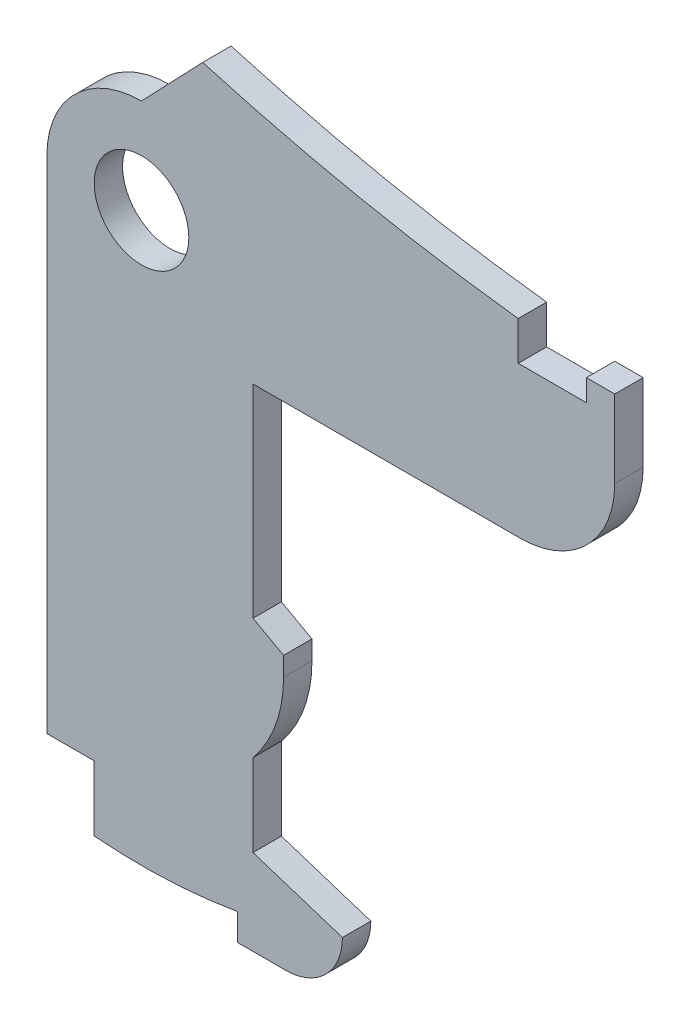
ISO-10303-21;
HEADER;
FILE_DESCRIPTION(('STEP AP214'),'2;1');
FILE_NAME('part.step','',(''),(''),'','','');
FILE_SCHEMA(('AUTOMOTIVE_DESIGN { 1 0 10303 214 1 1 1 1 }'));
ENDSEC;
DATA;
#1=APPLICATION_CONTEXT('core data for automotive mechanical design processes');
#2=APPLICATION_PROTOCOL_DEFINITION('international standard','automotive_design',2000,#1);
#3=PRODUCT_CONTEXT('',#1,'mechanical');
#4=PRODUCT('Part','Part','',(#3));
#5=PRODUCT_RELATED_PRODUCT_CATEGORY('part','',(#4));
#6=PRODUCT_DEFINITION_FORMATION('','',#4);
#7=PRODUCT_DEFINITION_CONTEXT('part definition',#1,'design');
#8=PRODUCT_DEFINITION('design','',#6,#7);
#9=PRODUCT_DEFINITION_SHAPE('','',#8);
#10=(LENGTH_UNIT() NAMED_UNIT(*) SI_UNIT(.MILLI.,.METRE.));
#11=(NAMED_UNIT(*) PLANE_ANGLE_UNIT() SI_UNIT($,.RADIAN.));
#12=(NAMED_UNIT(*) SI_UNIT($,.STERADIAN.) SOLID_ANGLE_UNIT());
#13=UNCERTAINTY_MEASURE_WITH_UNIT(LENGTH_MEASURE(1.E-05),#10,'distance_accuracy_value','');
#14=(GEOMETRIC_REPRESENTATION_CONTEXT(3) GLOBAL_UNCERTAINTY_ASSIGNED_CONTEXT((#13)) GLOBAL_UNIT_ASSIGNED_CONTEXT((#10,
#11,#12)) REPRESENTATION_CONTEXT('',''));
#15=CARTESIAN_POINT('',(0.,0.,0.));
#16=DIRECTION('',(0.,0.,1.));
#17=DIRECTION('',(1.,0.,0.));
#18=AXIS2_PLACEMENT_3D('',#15,#16,#17);
#19=CARTESIAN_POINT('',(0.,-69.1109493092821,1.5));
#20=DIRECTION('',(0.,1.,0.));
#21=DIRECTION('',(0.,0.,1.));
#22=AXIS2_PLACEMENT_3D('',#19,#20,#21);
#23=PLANE('',#22);
#24=DIRECTION('',(1.,0.,0.));
#25=VECTOR('',#24,1.);
#26=CARTESIAN_POINT('',(0.,-69.1109493092821,0.));
#27=LINE('',#26,#25);
#28=CARTESIAN_POINT('',(58.5628566486414,-69.1109493092821,0.));
#29=VERTEX_POINT('',#28);
#30=CARTESIAN_POINT('',(61.1004317090133,-69.1109493092821,0.));
#31=VERTEX_POINT('',#30);
#32=EDGE_CURVE('E227',#29,#31,#27,.T.);
#33=ORIENTED_EDGE('',*,*,#32,.T.);
#34=DIRECTION('',(0.,0.,-1.));
#35=VECTOR('',#34,1.);
#36=CARTESIAN_POINT('',(61.1004317090133,-69.1109493092821,1.5));
#37=LINE('',#36,#35);
#38=CARTESIAN_POINT('',(61.1004317090133,-69.1109493092821,1.5));
#39=VERTEX_POINT('',#38);
#40=EDGE_CURVE('E11',#39,#31,#37,.T.);
#41=ORIENTED_EDGE('',*,*,#40,.F.);
#42=DIRECTION('',(1.,0.,0.));
#43=VECTOR('',#42,1.);
#44=CARTESIAN_POINT('',(0.,-69.1109493092821,1.5));
#45=LINE('',#44,#43);
#46=CARTESIAN_POINT('',(58.5628566486414,-69.1109493092821,1.5));
#47=VERTEX_POINT('',#46);
#48=EDGE_CURVE('E399',#47,#39,#45,.T.);
#49=ORIENTED_EDGE('',*,*,#48,.F.);
#50=DIRECTION('',(0.,0.,-1.));
#51=VECTOR('',#50,1.);
#52=CARTESIAN_POINT('',(58.5628566486414,-69.1109493092821,1.5));
#53=LINE('',#52,#51);
#54=EDGE_CURVE('E223',#47,#29,#53,.T.);
#55=ORIENTED_EDGE('',*,*,#54,.T.);
#56=EDGE_LOOP('',(#33,#41,#49,#55));
#57=FACE_BOUND('',#56,.T.);
#58=ADVANCED_FACE('F35',(#57),#23,.F.);
#59=CARTESIAN_POINT('',(61.1004317090133,-66.1109493092821,1.5));
#60=DIRECTION('',(0.,0.,-1.));
#61=DIRECTION('',(-1.,0.,0.));
#62=AXIS2_PLACEMENT_3D('',#59,#60,#61);
#63=CYLINDRICAL_SURFACE('',#62,3.00000000000001);
#64=CARTESIAN_POINT('',(61.1004317090133,-66.1109493092821,0.));
#65=DIRECTION('',(0.,0.,1.));
#66=DIRECTION('',(1.,0.,0.));
#67=AXIS2_PLACEMENT_3D('',#64,#65,#66);
#68=CIRCLE('',#67,3.00000000000001);
#69=CARTESIAN_POINT('',(64.1004317090133,-66.1109493092821,0.));
#70=VERTEX_POINT('',#69);
#71=EDGE_CURVE('E230',#31,#70,#68,.T.);
#72=ORIENTED_EDGE('',*,*,#71,.T.);
#73=DIRECTION('',(0.,0.,-1.));
#74=VECTOR('',#73,1.);
#75=CARTESIAN_POINT('',(64.1004317090133,-66.1109493092821,1.5));
#76=LINE('',#75,#74);
#77=CARTESIAN_POINT('',(64.1004317090133,-66.1109493092821,1.5));
#78=VERTEX_POINT('',#77);
#79=EDGE_CURVE('E44',#78,#70,#76,.T.);
#80=ORIENTED_EDGE('',*,*,#79,.F.);
#81=CARTESIAN_POINT('',(61.1004317090133,-66.1109493092821,1.5));
#82=DIRECTION('',(0.,0.,1.));
#83=DIRECTION('',(1.,0.,0.));
#84=AXIS2_PLACEMENT_3D('',#81,#82,#83);
#85=CIRCLE('',#84,3.00000000000001);
#86=EDGE_CURVE('E139',#39,#78,#85,.T.);
#87=ORIENTED_EDGE('',*,*,#86,.F.);
#88=ORIENTED_EDGE('',*,*,#40,.T.);
#89=EDGE_LOOP('',(#72,#80,#87,#88));
#90=FACE_BOUND('',#89,.T.);
#91=ADVANCED_FACE('F413',(#90),#63,.T.);
#92=CARTESIAN_POINT('',(-13.2752413972475,-41.1476724947514,1.5));
#93=DIRECTION('',(-0.307040459564451,-0.951696462213899,0.));
#94=DIRECTION('',(0.951696462213899,-0.307040459564451,0.));
#95=AXIS2_PLACEMENT_3D('',#92,#93,#94);
#96=PLANE('',#95);
#97=DIRECTION('',(-0.951696462213899,0.307040459564451,0.));
#98=VECTOR('',#97,1.);
#99=CARTESIAN_POINT('',(-13.2752413972475,-41.1476724947514,0.));
#100=LINE('',#99,#98);
#101=CARTESIAN_POINT('',(59.3761202637687,-64.5867713650885,0.));
#102=VERTEX_POINT('',#101);
#103=EDGE_CURVE('E232',#70,#102,#100,.T.);
#104=ORIENTED_EDGE('',*,*,#103,.T.);
#105=DIRECTION('',(0.,0.,-1.));
#106=VECTOR('',#105,1.);
#107=CARTESIAN_POINT('',(59.3761202637687,-64.5867713650885,1.5));
#108=LINE('',#107,#106);
#109=CARTESIAN_POINT('',(59.3761202637687,-64.5867713650885,1.5));
#110=VERTEX_POINT('',#109);
#111=EDGE_CURVE('E325',#110,#102,#108,.T.);
#112=ORIENTED_EDGE('',*,*,#111,.F.);
#113=DIRECTION('',(-0.951696462213899,0.307040459564451,0.));
#114=VECTOR('',#113,1.);
#115=CARTESIAN_POINT('',(-13.2752413972475,-41.1476724947514,1.5));
#116=LINE('',#115,#114);
#117=EDGE_CURVE('E332',#78,#110,#116,.T.);
#118=ORIENTED_EDGE('',*,*,#117,.F.);
#119=ORIENTED_EDGE('',*,*,#79,.T.);
#120=EDGE_LOOP('',(#104,#112,#118,#119));
#121=FACE_BOUND('',#120,.T.);
#122=ADVANCED_FACE('F330',(#121),#96,.F.);
#123=CARTESIAN_POINT('',(59.3761202637687,0.,1.5));
#124=DIRECTION('',(1.,0.,0.));
#125=DIRECTION('',(0.,0.,-1.));
#126=AXIS2_PLACEMENT_3D('',#123,#124,#125);
#127=PLANE('',#126);
#128=DIRECTION('',(0.,-1.,0.));
#129=VECTOR('',#128,1.);
#130=CARTESIAN_POINT('',(59.3761202637687,0.,0.));
#131=LINE('',#130,#129);
#132=CARTESIAN_POINT('',(59.3761202637687,-60.2400285328767,0.));
#133=VERTEX_POINT('',#132);
#134=EDGE_CURVE('E235',#133,#102,#131,.T.);
#135=ORIENTED_EDGE('',*,*,#134,.F.);
#136=DIRECTION('',(0.,0.,-1.));
#137=VECTOR('',#136,1.);
#138=CARTESIAN_POINT('',(59.3761202637687,-60.2400285328767,1.5));
#139=LINE('',#138,#137);
#140=CARTESIAN_POINT('',(59.3761202637687,-60.2400285328767,1.5));
#141=VERTEX_POINT('',#140);
#142=EDGE_CURVE('E323',#141,#133,#139,.T.);
#143=ORIENTED_EDGE('',*,*,#142,.F.);
#144=DIRECTION('',(0.,-1.,0.));
#145=VECTOR('',#144,1.);
#146=CARTESIAN_POINT('',(59.3761202637687,0.,1.5));
#147=LINE('',#146,#145);
#148=EDGE_CURVE('E343',#141,#110,#147,.T.);
#149=ORIENTED_EDGE('',*,*,#148,.T.);
#150=ORIENTED_EDGE('',*,*,#111,.T.);
#151=EDGE_LOOP('',(#135,#143,#149,#150));
#152=FACE_BOUND('',#151,.T.);
#153=ADVANCED_FACE('F340',(#152),#127,.T.);
#154=CARTESIAN_POINT('',(53.95842090491,-55.7530720627505,1.5));
#155=DIRECTION('',(0.,0.,-1.));
#156=DIRECTION('',(-1.,0.,0.));
#157=AXIS2_PLACEMENT_3D('',#154,#155,#156);
#158=CYLINDRICAL_SURFACE('',#157,7.03450387076339);
#159=CARTESIAN_POINT('',(53.95842090491,-55.7530720627505,0.));
#160=DIRECTION('',(0.,0.,1.));
#161=DIRECTION('',(1.,0.,0.));
#162=AXIS2_PLACEMENT_3D('',#159,#160,#161);
#163=CIRCLE('',#162,7.03450387076339);
#164=CARTESIAN_POINT('',(60.9929247756734,-55.7530720627505,0.));
#165=VERTEX_POINT('',#164);
#166=EDGE_CURVE('E238',#165,#133,#163,.F.);
#167=ORIENTED_EDGE('',*,*,#166,.F.);
#168=DIRECTION('',(0.,0.,-1.));
#169=VECTOR('',#168,1.);
#170=CARTESIAN_POINT('',(60.9929247756734,-55.7530720627505,1.5));
#171=LINE('',#170,#169);
#172=CARTESIAN_POINT('',(60.9929247756734,-55.7530720627505,1.5));
#173=VERTEX_POINT('',#172);
#174=EDGE_CURVE('E321',#173,#165,#171,.T.);
#175=ORIENTED_EDGE('',*,*,#174,.F.);
#176=CARTESIAN_POINT('',(53.95842090491,-55.7530720627505,1.5));
#177=DIRECTION('',(0.,0.,1.));
#178=DIRECTION('',(1.,0.,0.));
#179=AXIS2_PLACEMENT_3D('',#176,#177,#178);
#180=CIRCLE('',#179,7.03450387076339);
#181=EDGE_CURVE('E346',#173,#141,#180,.F.);
#182=ORIENTED_EDGE('',*,*,#181,.T.);
#183=ORIENTED_EDGE('',*,*,#142,.T.);
#184=EDGE_LOOP('',(#167,#175,#182,#183));
#185=FACE_BOUND('',#184,.T.);
#186=ADVANCED_FACE('F423',(#185),#158,.T.);
#187=CARTESIAN_POINT('',(60.9929247756734,0.,1.5));
#188=DIRECTION('',(-1.,0.,0.));
#189=DIRECTION('',(0.,0.,1.));
#190=AXIS2_PLACEMENT_3D('',#187,#188,#189);
#191=PLANE('',#190);
#192=DIRECTION('',(0.,1.,0.));
#193=VECTOR('',#192,1.);
#194=CARTESIAN_POINT('',(60.9929247756734,0.,0.));
#195=LINE('',#194,#193);
#196=CARTESIAN_POINT('',(60.9929247756734,-54.7553142853299,0.));
#197=VERTEX_POINT('',#196);
#198=EDGE_CURVE('E241',#165,#197,#195,.T.);
#199=ORIENTED_EDGE('',*,*,#198,.T.);
#200=DIRECTION('',(0.,0.,-1.));
#201=VECTOR('',#200,1.);
#202=CARTESIAN_POINT('',(60.9929247756734,-54.7553142853299,1.5));
#203=LINE('',#202,#201);
#204=CARTESIAN_POINT('',(60.9929247756734,-54.7553142853299,1.5));
#205=VERTEX_POINT('',#204);
#206=EDGE_CURVE('E318',#205,#197,#203,.T.);
#207=ORIENTED_EDGE('',*,*,#206,.F.);
#208=DIRECTION('',(0.,1.,0.));
#209=VECTOR('',#208,1.);
#210=CARTESIAN_POINT('',(60.9929247756734,0.,1.5));
#211=LINE('',#210,#209);
#212=EDGE_CURVE('E348',#173,#205,#211,.T.);
#213=ORIENTED_EDGE('',*,*,#212,.F.);
#214=ORIENTED_EDGE('',*,*,#174,.T.);
#215=EDGE_LOOP('',(#199,#207,#213,#214));
#216=FACE_BOUND('',#215,.T.);
#217=ADVANCED_FACE('F426',(#216),#191,.F.);
#218=CARTESIAN_POINT('',(-8.97597044556049,-16.3550723728844,1.5));
#219=DIRECTION('',(-0.481123509234274,-0.876652821168162,0.));
#220=DIRECTION('',(0.876652821168162,-0.481123509234274,0.));
#221=AXIS2_PLACEMENT_3D('',#218,#219,#220);
#222=PLANE('',#221);
#223=DIRECTION('',(-0.876652821168162,0.481123509234274,0.));
#224=VECTOR('',#223,1.);
#225=CARTESIAN_POINT('',(-8.97597044556049,-16.3550723728844,0.));
#226=LINE('',#225,#224);
#227=CARTESIAN_POINT('',(59.3761202637687,-53.8679816472202,0.));
#228=VERTEX_POINT('',#227);
#229=EDGE_CURVE('E243',#197,#228,#226,.T.);
#230=ORIENTED_EDGE('',*,*,#229,.T.);
#231=DIRECTION('',(0.,0.,-1.));
#232=VECTOR('',#231,1.);
#233=CARTESIAN_POINT('',(59.3761202637687,-53.8679816472202,1.5));
#234=LINE('',#233,#232);
#235=CARTESIAN_POINT('',(59.3761202637687,-53.8679816472202,1.5));
#236=VERTEX_POINT('',#235);
#237=EDGE_CURVE('E316',#236,#228,#234,.T.);
#238=ORIENTED_EDGE('',*,*,#237,.F.);
#239=DIRECTION('',(-0.876652821168162,0.481123509234274,0.));
#240=VECTOR('',#239,1.);
#241=CARTESIAN_POINT('',(-8.97597044556049,-16.3550723728844,1.5));
#242=LINE('',#241,#240);
#243=EDGE_CURVE('E354',#205,#236,#242,.T.);
#244=ORIENTED_EDGE('',*,*,#243,.F.);
#245=ORIENTED_EDGE('',*,*,#206,.T.);
#246=EDGE_LOOP('',(#230,#238,#244,#245));
#247=FACE_BOUND('',#246,.T.);
#248=ADVANCED_FACE('F430',(#247),#222,.F.);
#249=CARTESIAN_POINT('',(59.3761202637687,0.,1.5));
#250=DIRECTION('',(1.,0.,0.));
#251=DIRECTION('',(0.,0.,-1.));
#252=AXIS2_PLACEMENT_3D('',#249,#250,#251);
#253=PLANE('',#252);
#254=DIRECTION('',(0.,-1.,0.));
#255=VECTOR('',#254,1.);
#256=CARTESIAN_POINT('',(59.3761202637687,0.,0.));
#257=LINE('',#256,#255);
#258=CARTESIAN_POINT('',(59.3761202637687,-43.149191929352,0.));
#259=VERTEX_POINT('',#258);
#260=EDGE_CURVE('E246',#259,#228,#257,.T.);
#261=ORIENTED_EDGE('',*,*,#260,.F.);
#262=DIRECTION('',(0.,0.,-1.));
#263=VECTOR('',#262,1.);
#264=CARTESIAN_POINT('',(59.3761202637687,-43.149191929352,1.5));
#265=LINE('',#264,#263);
#266=CARTESIAN_POINT('',(59.3761202637687,-43.149191929352,1.5));
#267=VERTEX_POINT('',#266);
#268=EDGE_CURVE('E314',#267,#259,#265,.T.);
#269=ORIENTED_EDGE('',*,*,#268,.F.);
#270=DIRECTION('',(0.,-1.,0.));
#271=VECTOR('',#270,1.);
#272=CARTESIAN_POINT('',(59.3761202637687,0.,1.5));
#273=LINE('',#272,#271);
#274=EDGE_CURVE('E356',#267,#236,#273,.T.);
#275=ORIENTED_EDGE('',*,*,#274,.T.);
#276=ORIENTED_EDGE('',*,*,#237,.T.);
#277=EDGE_LOOP('',(#261,#269,#275,#276));
#278=FACE_BOUND('',#277,.T.);
#279=ADVANCED_FACE('F434',(#278),#253,.T.);
#280=CARTESIAN_POINT('',(0.,-43.149191929352,1.5));
#281=DIRECTION('',(0.,-1.,0.));
#282=DIRECTION('',(0.,0.,-1.));
#283=AXIS2_PLACEMENT_3D('',#280,#281,#282);
#284=PLANE('',#283);
#285=DIRECTION('',(-1.,0.,0.));
#286=VECTOR('',#285,1.);
#287=CARTESIAN_POINT('',(0.,-43.149191929352,0.));
#288=LINE('',#287,#286);
#289=CARTESIAN_POINT('',(73.4867153231227,-43.149191929352,0.));
#290=VERTEX_POINT('',#289);
#291=EDGE_CURVE('E249',#290,#259,#288,.T.);
#292=ORIENTED_EDGE('',*,*,#291,.F.);
#293=DIRECTION('',(0.,0.,-1.));
#294=VECTOR('',#293,1.);
#295=CARTESIAN_POINT('',(73.4867153231227,-43.149191929352,1.5));
#296=LINE('',#295,#294);
#297=CARTESIAN_POINT('',(73.4867153231227,-43.149191929352,1.5));
#298=VERTEX_POINT('',#297);
#299=EDGE_CURVE('E312',#298,#290,#296,.T.);
#300=ORIENTED_EDGE('',*,*,#299,.F.);
#301=DIRECTION('',(-1.,0.,0.));
#302=VECTOR('',#301,1.);
#303=CARTESIAN_POINT('',(0.,-43.149191929352,1.5));
#304=LINE('',#303,#302);
#305=EDGE_CURVE('E359',#298,#267,#304,.T.);
#306=ORIENTED_EDGE('',*,*,#305,.T.);
#307=ORIENTED_EDGE('',*,*,#268,.T.);
#308=EDGE_LOOP('',(#292,#300,#306,#307));
#309=FACE_BOUND('',#308,.T.);
#310=ADVANCED_FACE('F438',(#309),#284,.T.);
#311=CARTESIAN_POINT('',(73.4867153231227,-38.149191929352,1.5));
#312=DIRECTION('',(0.,0.,-1.));
#313=DIRECTION('',(-1.,0.,0.));
#314=AXIS2_PLACEMENT_3D('',#311,#312,#313);
#315=CYLINDRICAL_SURFACE('',#314,5.);
#316=CARTESIAN_POINT('',(73.4867153231227,-38.149191929352,0.));
#317=DIRECTION('',(0.,0.,1.));
#318=DIRECTION('',(1.,0.,0.));
#319=AXIS2_PLACEMENT_3D('',#316,#317,#318);
#320=CIRCLE('',#319,5.);
#321=CARTESIAN_POINT('',(78.4867153231227,-38.149191929352,0.));
#322=VERTEX_POINT('',#321);
#323=EDGE_CURVE('E252',#322,#290,#320,.F.);
#324=ORIENTED_EDGE('',*,*,#323,.F.);
#325=DIRECTION('',(0.,0.,-1.));
#326=VECTOR('',#325,1.);
#327=CARTESIAN_POINT('',(78.4867153231227,-38.149191929352,1.5));
#328=LINE('',#327,#326);
#329=CARTESIAN_POINT('',(78.4867153231227,-38.149191929352,1.5));
#330=VERTEX_POINT('',#329);
#331=EDGE_CURVE('E310',#330,#322,#328,.T.);
#332=ORIENTED_EDGE('',*,*,#331,.F.);
#333=CARTESIAN_POINT('',(73.4867153231227,-38.149191929352,1.5));
#334=DIRECTION('',(0.,0.,1.));
#335=DIRECTION('',(1.,0.,0.));
#336=AXIS2_PLACEMENT_3D('',#333,#334,#335);
#337=CIRCLE('',#336,5.);
#338=EDGE_CURVE('E362',#330,#298,#337,.F.);
#339=ORIENTED_EDGE('',*,*,#338,.T.);
#340=ORIENTED_EDGE('',*,*,#299,.T.);
#341=EDGE_LOOP('',(#324,#332,#339,#340));
#342=FACE_BOUND('',#341,.T.);
#343=ADVANCED_FACE('F442',(#342),#315,.T.);
#344=CARTESIAN_POINT('',(78.4867153231227,0.,1.5));
#345=DIRECTION('',(1.,0.,0.));
#346=DIRECTION('',(0.,0.,-1.));
#347=AXIS2_PLACEMENT_3D('',#344,#345,#346);
#348=PLANE('',#347);
#349=DIRECTION('',(0.,-1.,0.));
#350=VECTOR('',#349,1.);
#351=CARTESIAN_POINT('',(78.4867153231227,0.,0.));
#352=LINE('',#351,#350);
#353=CARTESIAN_POINT('',(78.4867153231227,-34.0532753395048,0.));
#354=VERTEX_POINT('',#353);
#355=EDGE_CURVE('E255',#354,#322,#352,.T.);
#356=ORIENTED_EDGE('',*,*,#355,.F.);
#357=DIRECTION('',(0.,0.,-1.));
#358=VECTOR('',#357,1.);
#359=CARTESIAN_POINT('',(78.4867153231227,-34.0532753395048,1.5));
#360=LINE('',#359,#358);
#361=CARTESIAN_POINT('',(78.4867153231227,-34.0532753395048,1.5));
#362=VERTEX_POINT('',#361);
#363=EDGE_CURVE('E308',#362,#354,#360,.T.);
#364=ORIENTED_EDGE('',*,*,#363,.F.);
#365=DIRECTION('',(0.,-1.,0.));
#366=VECTOR('',#365,1.);
#367=CARTESIAN_POINT('',(78.4867153231227,0.,1.5));
#368=LINE('',#367,#366);
#369=EDGE_CURVE('E365',#362,#330,#368,.T.);
#370=ORIENTED_EDGE('',*,*,#369,.T.);
#371=ORIENTED_EDGE('',*,*,#331,.T.);
#372=EDGE_LOOP('',(#356,#364,#370,#371));
#373=FACE_BOUND('',#372,.T.);
#374=ADVANCED_FACE('F446',(#373),#348,.T.);
#375=CARTESIAN_POINT('',(0.,-34.0532753395048,1.5));
#376=DIRECTION('',(0.,1.,0.));
#377=DIRECTION('',(0.,0.,1.));
#378=AXIS2_PLACEMENT_3D('',#375,#376,#377);
#379=PLANE('',#378);
#380=DIRECTION('',(1.,0.,0.));
#381=VECTOR('',#380,1.);
#382=CARTESIAN_POINT('',(0.,-34.0532753395048,0.));
#383=LINE('',#382,#381);
#384=CARTESIAN_POINT('',(76.9867153231227,-34.0532753395048,0.));
#385=VERTEX_POINT('',#384);
#386=EDGE_CURVE('E258',#385,#354,#383,.T.);
#387=ORIENTED_EDGE('',*,*,#386,.F.);
#388=DIRECTION('',(0.,0.,-1.));
#389=VECTOR('',#388,1.);
#390=CARTESIAN_POINT('',(76.9867153231227,-34.0532753395048,1.5));
#391=LINE('',#390,#389);
#392=CARTESIAN_POINT('',(76.9867153231227,-34.0532753395048,1.5));
#393=VERTEX_POINT('',#392);
#394=EDGE_CURVE('E306',#393,#385,#391,.T.);
#395=ORIENTED_EDGE('',*,*,#394,.F.);
#396=DIRECTION('',(1.,0.,0.));
#397=VECTOR('',#396,1.);
#398=CARTESIAN_POINT('',(0.,-34.0532753395048,1.5));
#399=LINE('',#398,#397);
#400=EDGE_CURVE('E368',#393,#362,#399,.T.);
#401=ORIENTED_EDGE('',*,*,#400,.T.);
#402=ORIENTED_EDGE('',*,*,#363,.T.);
#403=EDGE_LOOP('',(#387,#395,#401,#402));
#404=FACE_BOUND('',#403,.T.);
#405=ADVANCED_FACE('F450',(#404),#379,.T.);
#406=CARTESIAN_POINT('',(76.9867153231227,0.,1.5));
#407=DIRECTION('',(-1.,0.,0.));
#408=DIRECTION('',(0.,0.,1.));
#409=AXIS2_PLACEMENT_3D('',#406,#407,#408);
#410=PLANE('',#409);
#411=DIRECTION('',(0.,1.,0.));
#412=VECTOR('',#411,1.);
#413=CARTESIAN_POINT('',(76.9867153231227,0.,0.));
#414=LINE('',#413,#412);
#415=CARTESIAN_POINT('',(76.9867153231227,-35.1984634641797,0.));
#416=VERTEX_POINT('',#415);
#417=EDGE_CURVE('E261',#416,#385,#414,.T.);
#418=ORIENTED_EDGE('',*,*,#417,.F.);
#419=DIRECTION('',(0.,0.,-1.));
#420=VECTOR('',#419,1.);
#421=CARTESIAN_POINT('',(76.9867153231227,-35.1984634641797,1.5));
#422=LINE('',#421,#420);
#423=CARTESIAN_POINT('',(76.9867153231227,-35.1984634641797,1.5));
#424=VERTEX_POINT('',#423);
#425=EDGE_CURVE('E304',#424,#416,#422,.T.);
#426=ORIENTED_EDGE('',*,*,#425,.F.);
#427=DIRECTION('',(0.,1.,0.));
#428=VECTOR('',#427,1.);
#429=CARTESIAN_POINT('',(76.9867153231227,0.,1.5));
#430=LINE('',#429,#428);
#431=EDGE_CURVE('E371',#424,#393,#430,.T.);
#432=ORIENTED_EDGE('',*,*,#431,.T.);
#433=ORIENTED_EDGE('',*,*,#394,.T.);
#434=EDGE_LOOP('',(#418,#426,#432,#433));
#435=FACE_BOUND('',#434,.T.);
#436=ADVANCED_FACE('F454',(#435),#410,.T.);
#437=CARTESIAN_POINT('',(0.,-35.1984634641797,1.5));
#438=DIRECTION('',(0.,1.,0.));
#439=DIRECTION('',(0.,0.,1.));
#440=AXIS2_PLACEMENT_3D('',#437,#438,#439);
#441=PLANE('',#440);
#442=DIRECTION('',(1.,0.,0.));
#443=VECTOR('',#442,1.);
#444=CARTESIAN_POINT('',(0.,-35.1984634641797,0.));
#445=LINE('',#444,#443);
#446=CARTESIAN_POINT('',(73.3867153231227,-35.1984634641797,0.));
#447=VERTEX_POINT('',#446);
#448=EDGE_CURVE('E264',#447,#416,#445,.T.);
#449=ORIENTED_EDGE('',*,*,#448,.F.);
#450=DIRECTION('',(0.,0.,-1.));
#451=VECTOR('',#450,1.);
#452=CARTESIAN_POINT('',(73.3867153231227,-35.1984634641797,1.5));
#453=LINE('',#452,#451);
#454=CARTESIAN_POINT('',(73.3867153231227,-35.1984634641797,1.5));
#455=VERTEX_POINT('',#454);
#456=EDGE_CURVE('E302',#455,#447,#453,.T.);
#457=ORIENTED_EDGE('',*,*,#456,.F.);
#458=DIRECTION('',(1.,0.,0.));
#459=VECTOR('',#458,1.);
#460=CARTESIAN_POINT('',(0.,-35.1984634641797,1.5));
#461=LINE('',#460,#459);
#462=EDGE_CURVE('E374',#455,#424,#461,.T.);
#463=ORIENTED_EDGE('',*,*,#462,.T.);
#464=ORIENTED_EDGE('',*,*,#425,.T.);
#465=EDGE_LOOP('',(#449,#457,#463,#464));
#466=FACE_BOUND('',#465,.T.);
#467=ADVANCED_FACE('F458',(#466),#441,.T.);
#468=CARTESIAN_POINT('',(73.3867153231227,0.,1.5));
#469=DIRECTION('',(1.,0.,0.));
#470=DIRECTION('',(0.,0.,-1.));
#471=AXIS2_PLACEMENT_3D('',#468,#469,#470);
#472=PLANE('',#471);
#473=DIRECTION('',(0.,-1.,0.));
#474=VECTOR('',#473,1.);
#475=CARTESIAN_POINT('',(73.3867153231227,0.,0.));
#476=LINE('',#475,#474);
#477=CARTESIAN_POINT('',(73.3867153231227,-33.149191929352,0.));
#478=VERTEX_POINT('',#477);
#479=EDGE_CURVE('E267',#478,#447,#476,.T.);
#480=ORIENTED_EDGE('',*,*,#479,.F.);
#481=DIRECTION('',(0.,0.,-1.));
#482=VECTOR('',#481,1.);
#483=CARTESIAN_POINT('',(73.3867153231227,-33.149191929352,1.5));
#484=LINE('',#483,#482);
#485=CARTESIAN_POINT('',(73.3867153231227,-33.149191929352,1.5));
#486=VERTEX_POINT('',#485);
#487=EDGE_CURVE('E300',#486,#478,#484,.T.);
#488=ORIENTED_EDGE('',*,*,#487,.F.);
#489=DIRECTION('',(0.,-1.,0.));
#490=VECTOR('',#489,1.);
#491=CARTESIAN_POINT('',(73.3867153231227,0.,1.5));
#492=LINE('',#491,#490);
#493=EDGE_CURVE('E377',#486,#455,#492,.T.);
#494=ORIENTED_EDGE('',*,*,#493,.T.);
#495=ORIENTED_EDGE('',*,*,#456,.T.);
#496=EDGE_LOOP('',(#480,#488,#494,#495));
#497=FACE_BOUND('',#496,.T.);
#498=ADVANCED_FACE('F462',(#497),#472,.T.);
#499=CARTESIAN_POINT('',(85.520841075924,69.3810826330756,1.5));
#500=DIRECTION('',(0.,0.,-1.));
#501=DIRECTION('',(-1.,0.,0.));
#502=AXIS2_PLACEMENT_3D('',#499,#500,#501);
#503=CYLINDRICAL_SURFACE('',#502,103.245795118405);
#504=CARTESIAN_POINT('',(85.520841075924,69.3810826330756,0.));
#505=DIRECTION('',(0.,0.,1.));
#506=DIRECTION('',(1.,0.,0.));
#507=AXIS2_PLACEMENT_3D('',#504,#505,#506);
#508=CIRCLE('',#507,103.245795118405);
#509=CARTESIAN_POINT('',(56.718627508621,-29.7659127992372,0.));
#510=VERTEX_POINT('',#509);
#511=EDGE_CURVE('E270',#478,#510,#508,.F.);
#512=ORIENTED_EDGE('',*,*,#511,.T.);
#513=DIRECTION('',(0.,0.,-1.));
#514=VECTOR('',#513,1.);
#515=CARTESIAN_POINT('',(56.718627508621,-29.7659127992372,1.5));
#516=LINE('',#515,#514);
#517=CARTESIAN_POINT('',(56.718627508621,-29.7659127992372,1.5));
#518=VERTEX_POINT('',#517);
#519=EDGE_CURVE('E298',#518,#510,#516,.T.);
#520=ORIENTED_EDGE('',*,*,#519,.F.);
#521=CARTESIAN_POINT('',(85.520841075924,69.3810826330756,1.5));
#522=DIRECTION('',(0.,0.,1.));
#523=DIRECTION('',(1.,0.,0.));
#524=AXIS2_PLACEMENT_3D('',#521,#522,#523);
#525=CIRCLE('',#524,103.245795118405);
#526=EDGE_CURVE('E380',#486,#518,#525,.F.);
#527=ORIENTED_EDGE('',*,*,#526,.F.);
#528=ORIENTED_EDGE('',*,*,#487,.T.);
#529=EDGE_LOOP('',(#512,#520,#527,#528));
#530=FACE_BOUND('',#529,.T.);
#531=ADVANCED_FACE('F466',(#530),#503,.F.);
#532=CARTESIAN_POINT('',(44.5238341929609,-42.5318505329619,1.5));
#533=DIRECTION('',(-0.723097327047915,0.690746158596745,0.));
#534=DIRECTION('',(-0.690746158596745,-0.723097327047915,0.));
#535=AXIS2_PLACEMENT_3D('',#532,#533,#534);
#536=PLANE('',#535);
#537=DIRECTION('',(0.690746158596745,0.723097327047916,0.));
#538=VECTOR('',#537,1.);
#539=CARTESIAN_POINT('',(44.5238341929609,-42.5318505329619,0.));
#540=LINE('',#539,#538);
#541=CARTESIAN_POINT('',(53.4867153231227,-33.149191929352,0.));
#542=VERTEX_POINT('',#541);
#543=EDGE_CURVE('E273',#542,#510,#540,.T.);
#544=ORIENTED_EDGE('',*,*,#543,.F.);
#545=DIRECTION('',(0.,0.,-1.));
#546=VECTOR('',#545,1.);
#547=CARTESIAN_POINT('',(53.4867153231227,-33.149191929352,1.5));
#548=LINE('',#547,#546);
#549=CARTESIAN_POINT('',(53.4867153231227,-33.149191929352,1.5));
#550=VERTEX_POINT('',#549);
#551=EDGE_CURVE('E296',#550,#542,#548,.T.);
#552=ORIENTED_EDGE('',*,*,#551,.F.);
#553=DIRECTION('',(0.690746158596745,0.723097327047916,0.));
#554=VECTOR('',#553,1.);
#555=CARTESIAN_POINT('',(44.5238341929609,-42.5318505329619,1.5));
#556=LINE('',#555,#554);
#557=EDGE_CURVE('E382',#550,#518,#556,.T.);
#558=ORIENTED_EDGE('',*,*,#557,.T.);
#559=ORIENTED_EDGE('',*,*,#519,.T.);
#560=EDGE_LOOP('',(#544,#552,#558,#559));
#561=FACE_BOUND('',#560,.T.);
#562=ADVANCED_FACE('F470',(#561),#536,.T.);
#563=CARTESIAN_POINT('',(53.4867153231227,-38.149191929352,1.5));
#564=DIRECTION('',(0.,0.,-1.));
#565=DIRECTION('',(-1.,0.,0.));
#566=AXIS2_PLACEMENT_3D('',#563,#564,#565);
#567=CYLINDRICAL_SURFACE('',#566,5.);
#568=CARTESIAN_POINT('',(53.4867153231227,-38.149191929352,0.));
#569=DIRECTION('',(0.,0.,1.));
#570=DIRECTION('',(1.,0.,0.));
#571=AXIS2_PLACEMENT_3D('',#568,#569,#570);
#572=CIRCLE('',#571,5.);
#573=CARTESIAN_POINT('',(48.4867153231227,-38.149191929352,0.));
#574=VERTEX_POINT('',#573);
#575=EDGE_CURVE('E276',#542,#574,#572,.T.);
#576=ORIENTED_EDGE('',*,*,#575,.T.);
#577=DIRECTION('',(0.,0.,-1.));
#578=VECTOR('',#577,1.);
#579=CARTESIAN_POINT('',(48.4867153231227,-38.149191929352,1.5));
#580=LINE('',#579,#578);
#581=CARTESIAN_POINT('',(48.4867153231227,-38.149191929352,1.5));
#582=VERTEX_POINT('',#581);
#583=EDGE_CURVE('E294',#582,#574,#580,.T.);
#584=ORIENTED_EDGE('',*,*,#583,.F.);
#585=CARTESIAN_POINT('',(53.4867153231227,-38.149191929352,1.5));
#586=DIRECTION('',(0.,0.,1.));
#587=DIRECTION('',(1.,0.,0.));
#588=AXIS2_PLACEMENT_3D('',#585,#586,#587);
#589=CIRCLE('',#588,5.);
#590=EDGE_CURVE('E385',#550,#582,#589,.T.);
#591=ORIENTED_EDGE('',*,*,#590,.F.);
#592=ORIENTED_EDGE('',*,*,#551,.T.);
#593=EDGE_LOOP('',(#576,#584,#591,#592));
#594=FACE_BOUND('',#593,.T.);
#595=ADVANCED_FACE('F474',(#594),#567,.T.);
#596=CARTESIAN_POINT('',(48.4867153231227,0.,1.5));
#597=DIRECTION('',(-1.,0.,0.));
#598=DIRECTION('',(0.,0.,1.));
#599=AXIS2_PLACEMENT_3D('',#596,#597,#598);
#600=PLANE('',#599);
#601=DIRECTION('',(0.,1.,0.));
#602=VECTOR('',#601,1.);
#603=CARTESIAN_POINT('',(48.4867153231227,0.,0.));
#604=LINE('',#603,#602);
#605=CARTESIAN_POINT('',(48.4867153231227,-64.5868697545103,0.));
#606=VERTEX_POINT('',#605);
#607=EDGE_CURVE('E279',#606,#574,#604,.T.);
#608=ORIENTED_EDGE('',*,*,#607,.F.);
#609=DIRECTION('',(0.,0.,-1.));
#610=VECTOR('',#609,1.);
#611=CARTESIAN_POINT('',(48.4867153231227,-64.5868697545103,1.5));
#612=LINE('',#611,#610);
#613=CARTESIAN_POINT('',(48.4867153231227,-64.5868697545103,1.5));
#614=VERTEX_POINT('',#613);
#615=EDGE_CURVE('E292',#614,#606,#612,.T.);
#616=ORIENTED_EDGE('',*,*,#615,.F.);
#617=DIRECTION('',(0.,1.,0.));
#618=VECTOR('',#617,1.);
#619=CARTESIAN_POINT('',(48.4867153231227,0.,1.5));
#620=LINE('',#619,#618);
#621=EDGE_CURVE('E218',#614,#582,#620,.T.);
#622=ORIENTED_EDGE('',*,*,#621,.T.);
#623=ORIENTED_EDGE('',*,*,#583,.T.);
#624=EDGE_LOOP('',(#608,#616,#622,#623));
#625=FACE_BOUND('',#624,.T.);
#626=ADVANCED_FACE('F389',(#625),#600,.T.);
#627=CARTESIAN_POINT('',(0.,-64.5868697545103,1.5));
#628=DIRECTION('',(0.,-1.,0.));
#629=DIRECTION('',(0.,0.,-1.));
#630=AXIS2_PLACEMENT_3D('',#627,#628,#629);
#631=PLANE('',#630);
#632=DIRECTION('',(-1.,0.,0.));
#633=VECTOR('',#632,1.);
#634=CARTESIAN_POINT('',(0.,-64.5868697545103,0.));
#635=LINE('',#634,#633);
#636=CARTESIAN_POINT('',(50.9867153231227,-64.5868697545103,0.));
#637=VERTEX_POINT('',#636);
#638=EDGE_CURVE('E282',#637,#606,#635,.T.);
#639=ORIENTED_EDGE('',*,*,#638,.F.);
#640=DIRECTION('',(0.,0.,-1.));
#641=VECTOR('',#640,1.);
#642=CARTESIAN_POINT('',(50.9867153231227,-64.5868697545103,1.5));
#643=LINE('',#642,#641);
#644=CARTESIAN_POINT('',(50.9867153231227,-64.5868697545103,1.5));
#645=VERTEX_POINT('',#644);
#646=EDGE_CURVE('E206',#645,#637,#643,.T.);
#647=ORIENTED_EDGE('',*,*,#646,.F.);
#648=DIRECTION('',(-1.,0.,0.));
#649=VECTOR('',#648,1.);
#650=CARTESIAN_POINT('',(0.,-64.5868697545103,1.5));
#651=LINE('',#650,#649);
#652=EDGE_CURVE('E216',#645,#614,#651,.T.);
#653=ORIENTED_EDGE('',*,*,#652,.T.);
#654=ORIENTED_EDGE('',*,*,#615,.T.);
#655=EDGE_LOOP('',(#639,#647,#653,#654));
#656=FACE_BOUND('',#655,.T.);
#657=ADVANCED_FACE('F395',(#656),#631,.T.);
#658=CARTESIAN_POINT('',(50.9867153231227,0.,1.5));
#659=DIRECTION('',(-1.,0.,0.));
#660=DIRECTION('',(0.,0.,1.));
#661=AXIS2_PLACEMENT_3D('',#658,#659,#660);
#662=PLANE('',#661);
#663=DIRECTION('',(0.,1.,0.));
#664=VECTOR('',#663,1.);
#665=CARTESIAN_POINT('',(50.9867153231227,0.,0.));
#666=LINE('',#665,#664);
#667=CARTESIAN_POINT('',(50.9867153231227,-68.0236662622613,0.));
#668=VERTEX_POINT('',#667);
#669=EDGE_CURVE('E205',#668,#637,#666,.T.);
#670=ORIENTED_EDGE('',*,*,#669,.F.);
#671=DIRECTION('',(0.,0.,-1.));
#672=VECTOR('',#671,1.);
#673=CARTESIAN_POINT('',(50.9867153231227,-68.0236662622613,1.5));
#674=LINE('',#673,#672);
#675=CARTESIAN_POINT('',(50.9867153231227,-68.0236662622613,1.5));
#676=VERTEX_POINT('',#675);
#677=EDGE_CURVE('E199',#676,#668,#674,.T.);
#678=ORIENTED_EDGE('',*,*,#677,.F.);
#679=DIRECTION('',(0.,1.,0.));
#680=VECTOR('',#679,1.);
#681=CARTESIAN_POINT('',(50.9867153231227,0.,1.5));
#682=LINE('',#681,#680);
#683=EDGE_CURVE('E203',#676,#645,#682,.T.);
#684=ORIENTED_EDGE('',*,*,#683,.T.);
#685=ORIENTED_EDGE('',*,*,#646,.T.);
#686=EDGE_LOOP('',(#670,#678,#684,#685));
#687=FACE_BOUND('',#686,.T.);
#688=ADVANCED_FACE('F201',(#687),#662,.T.);
#689=CARTESIAN_POINT('',(53.4867153231227,-38.149191929352,1.5));
#690=DIRECTION('',(0.,0.,-1.));
#691=DIRECTION('',(-1.,0.,0.));
#692=AXIS2_PLACEMENT_3D('',#689,#690,#691);
#693=CYLINDRICAL_SURFACE('',#692,29.9788961882798);
#694=CARTESIAN_POINT('',(53.4867153231227,-38.149191929352,0.));
#695=DIRECTION('',(0.,0.,1.));
#696=DIRECTION('',(1.,0.,0.));
#697=AXIS2_PLACEMENT_3D('',#694,#695,#696);
#698=CIRCLE('',#697,29.9788961882798);
#699=CARTESIAN_POINT('',(58.5628566486414,-67.6952069891028,0.));
#700=VERTEX_POINT('',#699);
#701=EDGE_CURVE('E125',#668,#700,#698,.T.);
#702=ORIENTED_EDGE('',*,*,#701,.T.);
#703=DIRECTION('',(0.,0.,-1.));
#704=VECTOR('',#703,1.);
#705=CARTESIAN_POINT('',(58.5628566486414,-67.6952069891028,1.5));
#706=LINE('',#705,#704);
#707=CARTESIAN_POINT('',(58.5628566486414,-67.6952069891028,1.5));
#708=VERTEX_POINT('',#707);
#709=EDGE_CURVE('E207',#708,#700,#706,.T.);
#710=ORIENTED_EDGE('',*,*,#709,.F.);
#711=CARTESIAN_POINT('',(53.4867153231227,-38.149191929352,1.5));
#712=DIRECTION('',(0.,0.,1.));
#713=DIRECTION('',(1.,0.,0.));
#714=AXIS2_PLACEMENT_3D('',#711,#712,#713);
#715=CIRCLE('',#714,29.9788961882798);
#716=EDGE_CURVE('E209',#676,#708,#715,.T.);
#717=ORIENTED_EDGE('',*,*,#716,.F.);
#718=ORIENTED_EDGE('',*,*,#677,.T.);
#719=EDGE_LOOP('',(#702,#710,#717,#718));
#720=FACE_BOUND('',#719,.T.);
#721=ADVANCED_FACE('F210',(#720),#693,.T.);
#722=CARTESIAN_POINT('',(53.4867153231227,-38.149191929352,1.5));
#723=DIRECTION('',(0.,0.,-1.));
#724=DIRECTION('',(-1.,0.,0.));
#725=AXIS2_PLACEMENT_3D('',#722,#723,#724);
#726=CYLINDRICAL_SURFACE('',#725,2.5);
#727=CARTESIAN_POINT('',(53.4867153231227,-38.149191929352,1.5));
#728=DIRECTION('',(0.,0.,1.));
#729=DIRECTION('',(1.,0.,0.));
#730=AXIS2_PLACEMENT_3D('',#727,#728,#729);
#731=CIRCLE('',#730,2.5);
#732=CARTESIAN_POINT('',(55.9867153231227,-38.149191929352,1.5));
#733=VERTEX_POINT('',#732);
#734=EDGE_CURVE('E288',#733,#733,#731,.T.);
#735=ORIENTED_EDGE('',*,*,#734,.T.);
#736=EDGE_LOOP('',(#735));
#737=FACE_BOUND('',#736,.T.);
#738=CARTESIAN_POINT('',(53.4867153231227,-38.149191929352,0.));
#739=DIRECTION('',(0.,0.,1.));
#740=DIRECTION('',(1.,0.,0.));
#741=AXIS2_PLACEMENT_3D('',#738,#739,#740);
#742=CIRCLE('',#741,2.5);
#743=CARTESIAN_POINT('',(55.9867153231227,-38.149191929352,0.));
#744=VERTEX_POINT('',#743);
#745=EDGE_CURVE('E224',#744,#744,#742,.T.);
#746=ORIENTED_EDGE('',*,*,#745,.F.);
#747=EDGE_LOOP('',(#746));
#748=FACE_BOUND('',#747,.T.);
#749=ADVANCED_FACE('F37',(#737,#748),#726,.F.);
#750=CARTESIAN_POINT('',(58.5628566486414,0.,1.5));
#751=DIRECTION('',(1.,0.,0.));
#752=DIRECTION('',(0.,0.,-1.));
#753=AXIS2_PLACEMENT_3D('',#750,#751,#752);
#754=PLANE('',#753);
#755=DIRECTION('',(0.,-1.,0.));
#756=VECTOR('',#755,1.);
#757=CARTESIAN_POINT('',(58.5628566486414,0.,0.));
#758=LINE('',#757,#756);
#759=EDGE_CURVE('E131',#700,#29,#758,.T.);
#760=ORIENTED_EDGE('',*,*,#759,.T.);
#761=ORIENTED_EDGE('',*,*,#54,.F.);
#762=DIRECTION('',(0.,-1.,0.));
#763=VECTOR('',#762,1.);
#764=CARTESIAN_POINT('',(58.5628566486414,0.,1.5));
#765=LINE('',#764,#763);
#766=EDGE_CURVE('E52',#708,#47,#765,.T.);
#767=ORIENTED_EDGE('',*,*,#766,.F.);
#768=ORIENTED_EDGE('',*,*,#709,.T.);
#769=EDGE_LOOP('',(#760,#761,#767,#768));
#770=FACE_BOUND('',#769,.T.);
#771=ADVANCED_FACE('F400',(#770),#754,.F.);
#772=CARTESIAN_POINT('',(0.,0.,1.5));
#773=DIRECTION('',(0.,0.,1.));
#774=DIRECTION('',(1.,0.,0.));
#775=AXIS2_PLACEMENT_3D('',#772,#773,#774);
#776=PLANE('',#775);
#777=ORIENTED_EDGE('',*,*,#734,.F.);
#778=EDGE_LOOP('',(#777));
#779=FACE_BOUND('',#778,.T.);
#780=ORIENTED_EDGE('',*,*,#48,.T.);
#781=ORIENTED_EDGE('',*,*,#86,.T.);
#782=ORIENTED_EDGE('',*,*,#117,.T.);
#783=ORIENTED_EDGE('',*,*,#148,.F.);
#784=ORIENTED_EDGE('',*,*,#181,.F.);
#785=ORIENTED_EDGE('',*,*,#212,.T.);
#786=ORIENTED_EDGE('',*,*,#243,.T.);
#787=ORIENTED_EDGE('',*,*,#274,.F.);
#788=ORIENTED_EDGE('',*,*,#305,.F.);
#789=ORIENTED_EDGE('',*,*,#338,.F.);
#790=ORIENTED_EDGE('',*,*,#369,.F.);
#791=ORIENTED_EDGE('',*,*,#400,.F.);
#792=ORIENTED_EDGE('',*,*,#431,.F.);
#793=ORIENTED_EDGE('',*,*,#462,.F.);
#794=ORIENTED_EDGE('',*,*,#493,.F.);
#795=ORIENTED_EDGE('',*,*,#526,.T.);
#796=ORIENTED_EDGE('',*,*,#557,.F.);
#797=ORIENTED_EDGE('',*,*,#590,.T.);
#798=ORIENTED_EDGE('',*,*,#621,.F.);
#799=ORIENTED_EDGE('',*,*,#652,.F.);
#800=ORIENTED_EDGE('',*,*,#683,.F.);
#801=ORIENTED_EDGE('',*,*,#716,.T.);
#802=ORIENTED_EDGE('',*,*,#766,.T.);
#803=EDGE_LOOP('',(#780,#781,#782,#783,#784,#785,#786,#787,#788,#789,#790,#791,#792,#793,#794,
#795,#796,#797,#798,#799,#800,#801,#802));
#804=FACE_BOUND('',#803,.T.);
#805=ADVANCED_FACE('F213',(#779,#804),#776,.T.);
#806=CARTESIAN_POINT('',(0.,0.,0.));
#807=DIRECTION('',(0.,0.,1.));
#808=DIRECTION('',(1.,0.,0.));
#809=AXIS2_PLACEMENT_3D('',#806,#807,#808);
#810=PLANE('',#809);
#811=ORIENTED_EDGE('',*,*,#745,.T.);
#812=EDGE_LOOP('',(#811));
#813=FACE_BOUND('',#812,.T.);
#814=ORIENTED_EDGE('',*,*,#32,.F.);
#815=ORIENTED_EDGE('',*,*,#759,.F.);
#816=ORIENTED_EDGE('',*,*,#701,.F.);
#817=ORIENTED_EDGE('',*,*,#669,.T.);
#818=ORIENTED_EDGE('',*,*,#638,.T.);
#819=ORIENTED_EDGE('',*,*,#607,.T.);
#820=ORIENTED_EDGE('',*,*,#575,.F.);
#821=ORIENTED_EDGE('',*,*,#543,.T.);
#822=ORIENTED_EDGE('',*,*,#511,.F.);
#823=ORIENTED_EDGE('',*,*,#479,.T.);
#824=ORIENTED_EDGE('',*,*,#448,.T.);
#825=ORIENTED_EDGE('',*,*,#417,.T.);
#826=ORIENTED_EDGE('',*,*,#386,.T.);
#827=ORIENTED_EDGE('',*,*,#355,.T.);
#828=ORIENTED_EDGE('',*,*,#323,.T.);
#829=ORIENTED_EDGE('',*,*,#291,.T.);
#830=ORIENTED_EDGE('',*,*,#260,.T.);
#831=ORIENTED_EDGE('',*,*,#229,.F.);
#832=ORIENTED_EDGE('',*,*,#198,.F.);
#833=ORIENTED_EDGE('',*,*,#166,.T.);
#834=ORIENTED_EDGE('',*,*,#134,.T.);
#835=ORIENTED_EDGE('',*,*,#103,.F.);
#836=ORIENTED_EDGE('',*,*,#71,.F.);
#837=EDGE_LOOP('',(#814,#815,#816,#817,#818,#819,#820,#821,#822,#823,#824,#825,#826,#827,#828,
#829,#830,#831,#832,#833,#834,#835,#836));
#838=FACE_BOUND('',#837,.T.);
#839=ADVANCED_FACE('F335',(#813,#838),#810,.F.);
#840=CLOSED_SHELL('',(#58,#91,#122,#153,#186,#217,#248,#279,#310,#343,#374,#405,#436,#467,#498,
#531,#562,#595,#626,#657,#688,#721,#749,#771,#805,#839));
#841=MANIFOLD_SOLID_BREP('B2',#840);
#842=ADVANCED_BREP_SHAPE_REPRESENTATION('',(#18,#841),#14);
#843=SHAPE_DEFINITION_REPRESENTATION(#9,#842);
ENDSEC;
END-ISO-10303-21;
